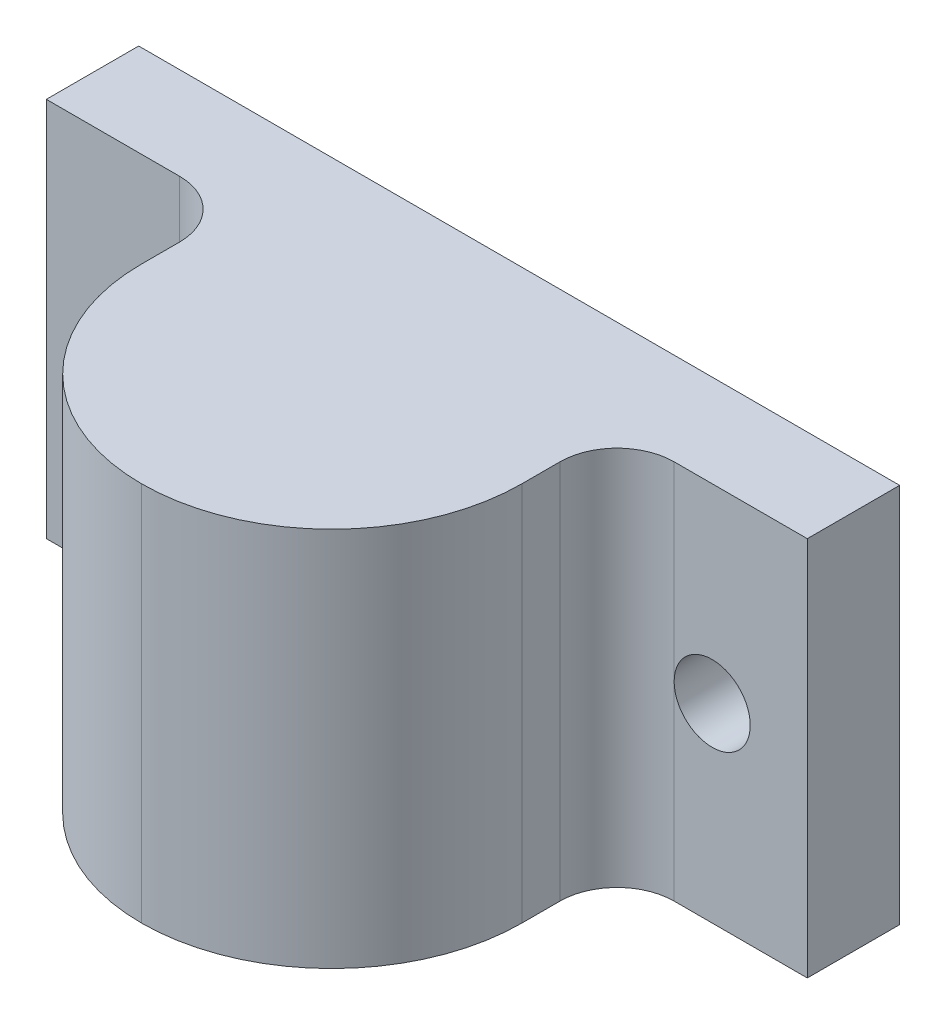
ISO-10303-21;
HEADER;
FILE_DESCRIPTION(('STEP AP214'),'2;1');
FILE_NAME('part.step','',(''),(''),'','','');
FILE_SCHEMA(('AUTOMOTIVE_DESIGN { 1 0 10303 214 1 1 1 1 }'));
ENDSEC;
DATA;
#1=APPLICATION_CONTEXT('core data for automotive mechanical design processes');
#2=APPLICATION_PROTOCOL_DEFINITION('international standard','automotive_design',2000,#1);
#3=PRODUCT_CONTEXT('',#1,'mechanical');
#4=PRODUCT('Part','Part','',(#3));
#5=PRODUCT_RELATED_PRODUCT_CATEGORY('part','',(#4));
#6=PRODUCT_DEFINITION_FORMATION('','',#4);
#7=PRODUCT_DEFINITION_CONTEXT('part definition',#1,'design');
#8=PRODUCT_DEFINITION('design','',#6,#7);
#9=PRODUCT_DEFINITION_SHAPE('','',#8);
#10=(LENGTH_UNIT() NAMED_UNIT(*) SI_UNIT(.MILLI.,.METRE.));
#11=(NAMED_UNIT(*) PLANE_ANGLE_UNIT() SI_UNIT($,.RADIAN.));
#12=(NAMED_UNIT(*) SI_UNIT($,.STERADIAN.) SOLID_ANGLE_UNIT());
#13=UNCERTAINTY_MEASURE_WITH_UNIT(LENGTH_MEASURE(1.E-05),#10,'distance_accuracy_value','');
#14=(GEOMETRIC_REPRESENTATION_CONTEXT(3) GLOBAL_UNCERTAINTY_ASSIGNED_CONTEXT((#13)) GLOBAL_UNIT_ASSIGNED_CONTEXT((#10,
#11,#12)) REPRESENTATION_CONTEXT('',''));
#15=CARTESIAN_POINT('',(0.,0.,0.));
#16=DIRECTION('',(0.,0.,1.));
#17=DIRECTION('',(1.,0.,0.));
#18=AXIS2_PLACEMENT_3D('',#15,#16,#17);
#19=CARTESIAN_POINT('',(-20.,10.,19.8547848106293));
#20=DIRECTION('',(1.,0.,0.));
#21=DIRECTION('',(0.,0.,-1.));
#22=AXIS2_PLACEMENT_3D('',#19,#20,#21);
#23=PLANE('',#22);
#24=DIRECTION('',(0.,-1.,0.));
#25=VECTOR('',#24,1.);
#26=CARTESIAN_POINT('',(-20.,10.,4.85478481062935));
#27=LINE('',#26,#25);
#28=CARTESIAN_POINT('',(-20.,10.,4.85478481062935));
#29=VERTEX_POINT('',#28);
#30=CARTESIAN_POINT('',(-20.,-10.,4.85478481062935));
#31=VERTEX_POINT('',#30);
#32=EDGE_CURVE('E201',#29,#31,#27,.T.);
#33=ORIENTED_EDGE('',*,*,#32,.F.);
#34=DIRECTION('',(0.,0.,-1.));
#35=VECTOR('',#34,1.);
#36=CARTESIAN_POINT('',(-20.,10.,19.8547848106293));
#37=LINE('',#36,#35);
#38=CARTESIAN_POINT('',(-20.,10.,0.));
#39=VERTEX_POINT('',#38);
#40=EDGE_CURVE('E146',#29,#39,#37,.T.);
#41=ORIENTED_EDGE('',*,*,#40,.T.);
#42=DIRECTION('',(0.,-1.,0.));
#43=VECTOR('',#42,1.);
#44=CARTESIAN_POINT('',(-20.,10.,0.));
#45=LINE('',#44,#43);
#46=CARTESIAN_POINT('',(-20.,-10.,0.));
#47=VERTEX_POINT('',#46);
#48=EDGE_CURVE('E218',#39,#47,#45,.T.);
#49=ORIENTED_EDGE('',*,*,#48,.T.);
#50=DIRECTION('',(0.,0.,-1.));
#51=VECTOR('',#50,1.);
#52=CARTESIAN_POINT('',(-20.,-10.,19.8547848106293));
#53=LINE('',#52,#51);
#54=EDGE_CURVE('E151',#31,#47,#53,.T.);
#55=ORIENTED_EDGE('',*,*,#54,.F.);
#56=EDGE_LOOP('',(#33,#41,#49,#55));
#57=FACE_BOUND('',#56,.T.);
#58=ADVANCED_FACE('F33',(#57),#23,.F.);
#59=CARTESIAN_POINT('',(20.,10.,19.8547848106293));
#60=DIRECTION('',(-1.,0.,0.));
#61=DIRECTION('',(0.,-1.,0.));
#62=AXIS2_PLACEMENT_3D('',#59,#60,#61);
#63=PLANE('',#62);
#64=DIRECTION('',(0.,0.,-1.));
#65=VECTOR('',#64,1.);
#66=CARTESIAN_POINT('',(20.,10.,19.8547848106293));
#67=LINE('',#66,#65);
#68=CARTESIAN_POINT('',(20.,10.,4.85478481062935));
#69=VERTEX_POINT('',#68);
#70=CARTESIAN_POINT('',(20.,10.,0.));
#71=VERTEX_POINT('',#70);
#72=EDGE_CURVE('E137',#69,#71,#67,.T.);
#73=ORIENTED_EDGE('',*,*,#72,.F.);
#74=DIRECTION('',(0.,1.,0.));
#75=VECTOR('',#74,1.);
#76=CARTESIAN_POINT('',(20.,10.,4.85478481062935));
#77=LINE('',#76,#75);
#78=CARTESIAN_POINT('',(20.,-10.,4.85478481062935));
#79=VERTEX_POINT('',#78);
#80=EDGE_CURVE('E121',#79,#69,#77,.T.);
#81=ORIENTED_EDGE('',*,*,#80,.F.);
#82=DIRECTION('',(0.,0.,-1.));
#83=VECTOR('',#82,1.);
#84=CARTESIAN_POINT('',(20.,-10.,19.8547848106293));
#85=LINE('',#84,#83);
#86=CARTESIAN_POINT('',(20.,-10.,0.));
#87=VERTEX_POINT('',#86);
#88=EDGE_CURVE('E224',#79,#87,#85,.T.);
#89=ORIENTED_EDGE('',*,*,#88,.T.);
#90=DIRECTION('',(0.,1.,0.));
#91=VECTOR('',#90,1.);
#92=CARTESIAN_POINT('',(20.,10.,0.));
#93=LINE('',#92,#91);
#94=EDGE_CURVE('E144',#87,#71,#93,.T.);
#95=ORIENTED_EDGE('',*,*,#94,.T.);
#96=EDGE_LOOP('',(#73,#81,#89,#95));
#97=FACE_BOUND('',#96,.T.);
#98=ADVANCED_FACE('F142',(#97),#63,.F.);
#99=CARTESIAN_POINT('',(-20.,10.,19.8547848106293));
#100=DIRECTION('',(0.,-1.,0.));
#101=DIRECTION('',(0.,0.,-1.));
#102=AXIS2_PLACEMENT_3D('',#99,#100,#101);
#103=PLANE('',#102);
#104=DIRECTION('',(-1.,0.,0.));
#105=VECTOR('',#104,1.);
#106=CARTESIAN_POINT('',(-20.,10.,4.85478481062935));
#107=LINE('',#106,#105);
#108=CARTESIAN_POINT('',(-13.,10.,4.85478481062935));
#109=VERTEX_POINT('',#108);
#110=EDGE_CURVE('E202',#109,#29,#107,.T.);
#111=ORIENTED_EDGE('',*,*,#110,.F.);
#112=CARTESIAN_POINT('',(-13.,10.,7.85478481062935));
#113=DIRECTION('',(0.,-1.,0.));
#114=DIRECTION('',(0.,0.,-1.));
#115=AXIS2_PLACEMENT_3D('',#112,#113,#114);
#116=CIRCLE('',#115,3.);
#117=CARTESIAN_POINT('',(-10.,10.,7.85478481062935));
#118=VERTEX_POINT('',#117);
#119=EDGE_CURVE('E182',#109,#118,#116,.T.);
#120=ORIENTED_EDGE('',*,*,#119,.T.);
#121=DIRECTION('',(0.,0.,1.));
#122=VECTOR('',#121,1.);
#123=CARTESIAN_POINT('',(-10.,10.,4.85478481062935));
#124=LINE('',#123,#122);
#125=CARTESIAN_POINT('',(-10.,10.,9.85478481062935));
#126=VERTEX_POINT('',#125);
#127=EDGE_CURVE('E210',#118,#126,#124,.T.);
#128=ORIENTED_EDGE('',*,*,#127,.T.);
#129=CARTESIAN_POINT('',(0.,10.,9.85478481062935));
#130=DIRECTION('',(0.,-1.,0.));
#131=DIRECTION('',(0.,0.,-1.));
#132=AXIS2_PLACEMENT_3D('',#129,#130,#131);
#133=CIRCLE('',#132,10.);
#134=CARTESIAN_POINT('',(0.,10.,19.8547848106293));
#135=VERTEX_POINT('',#134);
#136=EDGE_CURVE('E165',#126,#135,#133,.F.);
#137=ORIENTED_EDGE('',*,*,#136,.T.);
#138=CARTESIAN_POINT('',(0.,10.,9.85478481062935));
#139=DIRECTION('',(0.,-1.,0.));
#140=DIRECTION('',(0.,0.,-1.));
#141=AXIS2_PLACEMENT_3D('',#138,#139,#140);
#142=CIRCLE('',#141,10.);
#143=CARTESIAN_POINT('',(10.,10.,9.85478481062935));
#144=VERTEX_POINT('',#143);
#145=EDGE_CURVE('E159',#135,#144,#142,.F.);
#146=ORIENTED_EDGE('',*,*,#145,.T.);
#147=DIRECTION('',(0.,0.,1.));
#148=VECTOR('',#147,1.);
#149=CARTESIAN_POINT('',(10.,10.,4.85478481062935));
#150=LINE('',#149,#148);
#151=CARTESIAN_POINT('',(10.,10.,7.85478481062935));
#152=VERTEX_POINT('',#151);
#153=EDGE_CURVE('E287',#152,#144,#150,.T.);
#154=ORIENTED_EDGE('',*,*,#153,.F.);
#155=CARTESIAN_POINT('',(13.,10.,7.85478481062935));
#156=DIRECTION('',(0.,-1.,0.));
#157=DIRECTION('',(0.,0.,-1.));
#158=AXIS2_PLACEMENT_3D('',#155,#156,#157);
#159=CIRCLE('',#158,3.);
#160=CARTESIAN_POINT('',(13.,10.,4.85478481062935));
#161=VERTEX_POINT('',#160);
#162=EDGE_CURVE('E11',#152,#161,#159,.T.);
#163=ORIENTED_EDGE('',*,*,#162,.T.);
#164=DIRECTION('',(-1.,0.,0.));
#165=VECTOR('',#164,1.);
#166=CARTESIAN_POINT('',(20.,10.,4.85478481062935));
#167=LINE('',#166,#165);
#168=EDGE_CURVE('E125',#69,#161,#167,.T.);
#169=ORIENTED_EDGE('',*,*,#168,.F.);
#170=ORIENTED_EDGE('',*,*,#72,.T.);
#171=DIRECTION('',(-1.,0.,0.));
#172=VECTOR('',#171,1.);
#173=CARTESIAN_POINT('',(-20.,10.,0.));
#174=LINE('',#173,#172);
#175=EDGE_CURVE('E216',#71,#39,#174,.T.);
#176=ORIENTED_EDGE('',*,*,#175,.T.);
#177=ORIENTED_EDGE('',*,*,#40,.F.);
#178=EDGE_LOOP('',(#111,#120,#128,#137,#146,#154,#163,#169,#170,#176,#177));
#179=FACE_BOUND('',#178,.T.);
#180=ADVANCED_FACE('F135',(#179),#103,.F.);
#181=CARTESIAN_POINT('',(-20.,-10.,19.8547848106293));
#182=DIRECTION('',(0.,1.,0.));
#183=DIRECTION('',(0.,0.,1.));
#184=AXIS2_PLACEMENT_3D('',#181,#182,#183);
#185=PLANE('',#184);
#186=CARTESIAN_POINT('',(0.,-10.,12.5));
#187=DIRECTION('',(0.,-1.,0.));
#188=DIRECTION('',(0.,0.,-1.));
#189=AXIS2_PLACEMENT_3D('',#186,#187,#188);
#190=CIRCLE('',#189,4.);
#191=CARTESIAN_POINT('',(0.,-10.,8.5));
#192=VERTEX_POINT('',#191);
#193=EDGE_CURVE('E281',#192,#192,#190,.T.);
#194=ORIENTED_EDGE('',*,*,#193,.F.);
#195=EDGE_LOOP('',(#194));
#196=FACE_BOUND('',#195,.T.);
#197=CARTESIAN_POINT('',(0.,-10.,9.85478481062935));
#198=DIRECTION('',(0.,1.,0.));
#199=DIRECTION('',(0.,0.,1.));
#200=AXIS2_PLACEMENT_3D('',#197,#198,#199);
#201=CIRCLE('',#200,10.);
#202=CARTESIAN_POINT('',(10.,-10.,9.85478481062935));
#203=VERTEX_POINT('',#202);
#204=CARTESIAN_POINT('',(0.,-10.,19.8547848106293));
#205=VERTEX_POINT('',#204);
#206=EDGE_CURVE('E149',#203,#205,#201,.F.);
#207=ORIENTED_EDGE('',*,*,#206,.T.);
#208=CARTESIAN_POINT('',(0.,-10.,9.85478481062935));
#209=DIRECTION('',(0.,1.,0.));
#210=DIRECTION('',(0.,0.,1.));
#211=AXIS2_PLACEMENT_3D('',#208,#209,#210);
#212=CIRCLE('',#211,10.);
#213=CARTESIAN_POINT('',(-10.,-10.,9.85478481062935));
#214=VERTEX_POINT('',#213);
#215=EDGE_CURVE('E167',#205,#214,#212,.F.);
#216=ORIENTED_EDGE('',*,*,#215,.T.);
#217=DIRECTION('',(0.,0.,1.));
#218=VECTOR('',#217,1.);
#219=CARTESIAN_POINT('',(-10.,-10.,4.85478481062935));
#220=LINE('',#219,#218);
#221=CARTESIAN_POINT('',(-10.,-10.,7.85478481062935));
#222=VERTEX_POINT('',#221);
#223=EDGE_CURVE('E192',#222,#214,#220,.T.);
#224=ORIENTED_EDGE('',*,*,#223,.F.);
#225=CARTESIAN_POINT('',(-13.,-10.,7.85478481062935));
#226=DIRECTION('',(0.,1.,0.));
#227=DIRECTION('',(0.,0.,1.));
#228=AXIS2_PLACEMENT_3D('',#225,#226,#227);
#229=CIRCLE('',#228,3.);
#230=CARTESIAN_POINT('',(-13.,-10.,4.85478481062935));
#231=VERTEX_POINT('',#230);
#232=EDGE_CURVE('E184',#222,#231,#229,.T.);
#233=ORIENTED_EDGE('',*,*,#232,.T.);
#234=DIRECTION('',(1.,0.,0.));
#235=VECTOR('',#234,1.);
#236=CARTESIAN_POINT('',(-20.,-10.,4.85478481062935));
#237=LINE('',#236,#235);
#238=EDGE_CURVE('E190',#31,#231,#237,.T.);
#239=ORIENTED_EDGE('',*,*,#238,.F.);
#240=ORIENTED_EDGE('',*,*,#54,.T.);
#241=DIRECTION('',(1.,0.,0.));
#242=VECTOR('',#241,1.);
#243=CARTESIAN_POINT('',(-20.,-10.,0.));
#244=LINE('',#243,#242);
#245=EDGE_CURVE('E221',#47,#87,#244,.T.);
#246=ORIENTED_EDGE('',*,*,#245,.T.);
#247=ORIENTED_EDGE('',*,*,#88,.F.);
#248=DIRECTION('',(1.,0.,0.));
#249=VECTOR('',#248,1.);
#250=CARTESIAN_POINT('',(20.,-10.,4.85478481062935));
#251=LINE('',#250,#249);
#252=CARTESIAN_POINT('',(13.,-10.,4.85478481062935));
#253=VERTEX_POINT('',#252);
#254=EDGE_CURVE('E127',#253,#79,#251,.T.);
#255=ORIENTED_EDGE('',*,*,#254,.F.);
#256=CARTESIAN_POINT('',(13.,-10.,7.85478481062935));
#257=DIRECTION('',(0.,1.,0.));
#258=DIRECTION('',(0.,0.,1.));
#259=AXIS2_PLACEMENT_3D('',#256,#257,#258);
#260=CIRCLE('',#259,3.);
#261=CARTESIAN_POINT('',(10.,-10.,7.85478481062935));
#262=VERTEX_POINT('',#261);
#263=EDGE_CURVE('E41',#253,#262,#260,.T.);
#264=ORIENTED_EDGE('',*,*,#263,.T.);
#265=DIRECTION('',(0.,0.,1.));
#266=VECTOR('',#265,1.);
#267=CARTESIAN_POINT('',(10.,-10.,4.85478481062935));
#268=LINE('',#267,#266);
#269=EDGE_CURVE('E288',#262,#203,#268,.T.);
#270=ORIENTED_EDGE('',*,*,#269,.T.);
#271=EDGE_LOOP('',(#207,#216,#224,#233,#239,#240,#246,#247,#255,#264,#270));
#272=FACE_BOUND('',#271,.T.);
#273=ADVANCED_FACE('F189',(#196,#272),#185,.F.);
#274=CARTESIAN_POINT('',(0.,0.,0.));
#275=DIRECTION('',(0.,0.,1.));
#276=DIRECTION('',(1.,0.,0.));
#277=AXIS2_PLACEMENT_3D('',#274,#275,#276);
#278=PLANE('',#277);
#279=CARTESIAN_POINT('',(15.,0.,0.));
#280=DIRECTION('',(0.,0.,1.));
#281=DIRECTION('',(1.,0.,0.));
#282=AXIS2_PLACEMENT_3D('',#279,#280,#281);
#283=CIRCLE('',#282,2.);
#284=CARTESIAN_POINT('',(17.,0.,0.));
#285=VERTEX_POINT('',#284);
#286=EDGE_CURVE('E273',#285,#285,#283,.T.);
#287=ORIENTED_EDGE('',*,*,#286,.T.);
#288=EDGE_LOOP('',(#287));
#289=FACE_BOUND('',#288,.T.);
#290=CARTESIAN_POINT('',(-15.,0.,0.));
#291=DIRECTION('',(0.,0.,1.));
#292=DIRECTION('',(1.,0.,0.));
#293=AXIS2_PLACEMENT_3D('',#290,#291,#292);
#294=CIRCLE('',#293,2.);
#295=CARTESIAN_POINT('',(-13.,0.,0.));
#296=VERTEX_POINT('',#295);
#297=EDGE_CURVE('E278',#296,#296,#294,.T.);
#298=ORIENTED_EDGE('',*,*,#297,.T.);
#299=EDGE_LOOP('',(#298));
#300=FACE_BOUND('',#299,.T.);
#301=ORIENTED_EDGE('',*,*,#94,.F.);
#302=ORIENTED_EDGE('',*,*,#245,.F.);
#303=ORIENTED_EDGE('',*,*,#48,.F.);
#304=ORIENTED_EDGE('',*,*,#175,.F.);
#305=EDGE_LOOP('',(#301,#302,#303,#304));
#306=FACE_BOUND('',#305,.T.);
#307=ADVANCED_FACE('F229',(#289,#300,#306),#278,.F.);
#308=CARTESIAN_POINT('',(-10.,10.,4.85478481062935));
#309=DIRECTION('',(1.,0.,0.));
#310=DIRECTION('',(0.,1.,0.));
#311=AXIS2_PLACEMENT_3D('',#308,#309,#310);
#312=PLANE('',#311);
#313=ORIENTED_EDGE('',*,*,#127,.F.);
#314=DIRECTION('',(0.,1.,0.));
#315=VECTOR('',#314,1.);
#316=CARTESIAN_POINT('',(-10.,10.,7.85478481062935));
#317=LINE('',#316,#315);
#318=EDGE_CURVE('E175',#118,#222,#317,.F.);
#319=ORIENTED_EDGE('',*,*,#318,.T.);
#320=ORIENTED_EDGE('',*,*,#223,.T.);
#321=DIRECTION('',(0.,1.,0.));
#322=VECTOR('',#321,1.);
#323=CARTESIAN_POINT('',(-10.,10.,9.85478481062935));
#324=LINE('',#323,#322);
#325=EDGE_CURVE('E162',#214,#126,#324,.T.);
#326=ORIENTED_EDGE('',*,*,#325,.T.);
#327=EDGE_LOOP('',(#313,#319,#320,#326));
#328=FACE_BOUND('',#327,.T.);
#329=ADVANCED_FACE('F231',(#328),#312,.F.);
#330=CARTESIAN_POINT('',(0.,0.,4.85478481062935));
#331=DIRECTION('',(0.,0.,1.));
#332=DIRECTION('',(1.,0.,0.));
#333=AXIS2_PLACEMENT_3D('',#330,#331,#332);
#334=PLANE('',#333);
#335=ORIENTED_EDGE('',*,*,#238,.T.);
#336=DIRECTION('',(0.,1.,0.));
#337=VECTOR('',#336,1.);
#338=CARTESIAN_POINT('',(-13.,0.,4.85478481062935));
#339=LINE('',#338,#337);
#340=CARTESIAN_POINT('',(-13.,0.,4.85478481062935));
#341=VERTEX_POINT('',#340);
#342=EDGE_CURVE('E172',#231,#341,#339,.T.);
#343=ORIENTED_EDGE('',*,*,#342,.T.);
#344=CARTESIAN_POINT('',(-15.,0.,4.85478481062935));
#345=DIRECTION('',(0.,0.,1.));
#346=DIRECTION('',(1.,0.,0.));
#347=AXIS2_PLACEMENT_3D('',#344,#345,#346);
#348=CIRCLE('',#347,2.);
#349=EDGE_CURVE('E206',#341,#341,#348,.T.);
#350=ORIENTED_EDGE('',*,*,#349,.F.);
#351=DIRECTION('',(0.,1.,0.));
#352=VECTOR('',#351,1.);
#353=CARTESIAN_POINT('',(-13.,0.,4.85478481062935));
#354=LINE('',#353,#352);
#355=EDGE_CURVE('E170',#341,#109,#354,.T.);
#356=ORIENTED_EDGE('',*,*,#355,.T.);
#357=ORIENTED_EDGE('',*,*,#110,.T.);
#358=ORIENTED_EDGE('',*,*,#32,.T.);
#359=EDGE_LOOP('',(#335,#343,#350,#356,#357,#358));
#360=FACE_BOUND('',#359,.T.);
#361=ADVANCED_FACE('F197',(#360),#334,.T.);
#362=CARTESIAN_POINT('',(10.,10.,4.85478481062935));
#363=DIRECTION('',(-1.,0.,0.));
#364=DIRECTION('',(0.,-1.,0.));
#365=AXIS2_PLACEMENT_3D('',#362,#363,#364);
#366=PLANE('',#365);
#367=ORIENTED_EDGE('',*,*,#269,.F.);
#368=DIRECTION('',(0.,-1.,0.));
#369=VECTOR('',#368,1.);
#370=CARTESIAN_POINT('',(10.,10.,7.85478481062935));
#371=LINE('',#370,#369);
#372=EDGE_CURVE('E54',#262,#152,#371,.F.);
#373=ORIENTED_EDGE('',*,*,#372,.T.);
#374=ORIENTED_EDGE('',*,*,#153,.T.);
#375=DIRECTION('',(0.,-1.,0.));
#376=VECTOR('',#375,1.);
#377=CARTESIAN_POINT('',(10.,-9.99999999999999,9.85478481062935));
#378=LINE('',#377,#376);
#379=EDGE_CURVE('E145',#144,#203,#378,.T.);
#380=ORIENTED_EDGE('',*,*,#379,.T.);
#381=EDGE_LOOP('',(#367,#373,#374,#380));
#382=FACE_BOUND('',#381,.T.);
#383=ADVANCED_FACE('F290',(#382),#366,.F.);
#384=CARTESIAN_POINT('',(0.,0.,4.85478481062935));
#385=DIRECTION('',(0.,0.,-1.));
#386=DIRECTION('',(-1.,0.,0.));
#387=AXIS2_PLACEMENT_3D('',#384,#385,#386);
#388=PLANE('',#387);
#389=ORIENTED_EDGE('',*,*,#168,.T.);
#390=DIRECTION('',(0.,-1.,0.));
#391=VECTOR('',#390,1.);
#392=CARTESIAN_POINT('',(13.,-10.,4.85478481062935));
#393=LINE('',#392,#391);
#394=CARTESIAN_POINT('',(13.,0.,4.85478481062935));
#395=VERTEX_POINT('',#394);
#396=EDGE_CURVE('E179',#161,#395,#393,.T.);
#397=ORIENTED_EDGE('',*,*,#396,.T.);
#398=CARTESIAN_POINT('',(15.,0.,4.85478481062935));
#399=DIRECTION('',(0.,0.,1.));
#400=DIRECTION('',(1.,0.,0.));
#401=AXIS2_PLACEMENT_3D('',#398,#399,#400);
#402=CIRCLE('',#401,2.);
#403=EDGE_CURVE('E270',#395,#395,#402,.T.);
#404=ORIENTED_EDGE('',*,*,#403,.F.);
#405=DIRECTION('',(0.,-1.,0.));
#406=VECTOR('',#405,1.);
#407=CARTESIAN_POINT('',(13.,-10.,4.85478481062935));
#408=LINE('',#407,#406);
#409=EDGE_CURVE('E177',#395,#253,#408,.T.);
#410=ORIENTED_EDGE('',*,*,#409,.T.);
#411=ORIENTED_EDGE('',*,*,#254,.T.);
#412=ORIENTED_EDGE('',*,*,#80,.T.);
#413=EDGE_LOOP('',(#389,#397,#404,#410,#411,#412));
#414=FACE_BOUND('',#413,.T.);
#415=ADVANCED_FACE('F123',(#414),#388,.F.);
#416=CARTESIAN_POINT('',(0.,5.,12.5));
#417=DIRECTION('',(0.,-1.,0.));
#418=DIRECTION('',(0.,0.,-1.));
#419=AXIS2_PLACEMENT_3D('',#416,#417,#418);
#420=CYLINDRICAL_SURFACE('',#419,4.);
#421=CARTESIAN_POINT('',(0.,5.,12.5));
#422=DIRECTION('',(0.,-1.,0.));
#423=DIRECTION('',(0.,0.,-1.));
#424=AXIS2_PLACEMENT_3D('',#421,#422,#423);
#425=CIRCLE('',#424,4.);
#426=CARTESIAN_POINT('',(0.,5.,8.5));
#427=VERTEX_POINT('',#426);
#428=EDGE_CURVE('E131',#427,#427,#425,.T.);
#429=ORIENTED_EDGE('',*,*,#428,.F.);
#430=EDGE_LOOP('',(#429));
#431=FACE_BOUND('',#430,.T.);
#432=ORIENTED_EDGE('',*,*,#193,.T.);
#433=EDGE_LOOP('',(#432));
#434=FACE_BOUND('',#433,.T.);
#435=ADVANCED_FACE('F304',(#431,#434),#420,.F.);
#436=CARTESIAN_POINT('',(0.,5.,12.5));
#437=DIRECTION('',(0.,-1.,0.));
#438=DIRECTION('',(0.,0.,-1.));
#439=AXIS2_PLACEMENT_3D('',#436,#437,#438);
#440=PLANE('',#439);
#441=ORIENTED_EDGE('',*,*,#428,.T.);
#442=EDGE_LOOP('',(#441));
#443=FACE_BOUND('',#442,.T.);
#444=ADVANCED_FACE('F310',(#443),#440,.T.);
#445=CARTESIAN_POINT('',(-15.,0.,-0.145215189370651));
#446=DIRECTION('',(0.,0.,1.));
#447=DIRECTION('',(1.,0.,0.));
#448=AXIS2_PLACEMENT_3D('',#445,#446,#447);
#449=CYLINDRICAL_SURFACE('',#448,2.);
#450=ORIENTED_EDGE('',*,*,#349,.T.);
#451=EDGE_LOOP('',(#450));
#452=FACE_BOUND('',#451,.T.);
#453=ORIENTED_EDGE('',*,*,#297,.F.);
#454=EDGE_LOOP('',(#453));
#455=FACE_BOUND('',#454,.T.);
#456=ADVANCED_FACE('F314',(#452,#455),#449,.F.);
#457=CARTESIAN_POINT('',(15.,0.,-0.145215189370651));
#458=DIRECTION('',(0.,0.,1.));
#459=DIRECTION('',(1.,0.,0.));
#460=AXIS2_PLACEMENT_3D('',#457,#458,#459);
#461=CYLINDRICAL_SURFACE('',#460,2.);
#462=ORIENTED_EDGE('',*,*,#403,.T.);
#463=EDGE_LOOP('',(#462));
#464=FACE_BOUND('',#463,.T.);
#465=ORIENTED_EDGE('',*,*,#286,.F.);
#466=EDGE_LOOP('',(#465));
#467=FACE_BOUND('',#466,.T.);
#468=ADVANCED_FACE('F257',(#464,#467),#461,.F.);
#469=CARTESIAN_POINT('',(0.,10.,9.85478481062935));
#470=DIRECTION('',(0.,1.,0.));
#471=DIRECTION('',(-1.,0.,0.));
#472=AXIS2_PLACEMENT_3D('',#469,#470,#471);
#473=CYLINDRICAL_SURFACE('',#472,10.);
#474=ORIENTED_EDGE('',*,*,#145,.F.);
#475=DIRECTION('',(0.,-1.,0.));
#476=VECTOR('',#475,1.);
#477=CARTESIAN_POINT('',(0.,10.,19.8547848106293));
#478=LINE('',#477,#476);
#479=EDGE_CURVE('E156',#205,#135,#478,.F.);
#480=ORIENTED_EDGE('',*,*,#479,.F.);
#481=ORIENTED_EDGE('',*,*,#206,.F.);
#482=ORIENTED_EDGE('',*,*,#379,.F.);
#483=EDGE_LOOP('',(#474,#480,#481,#482));
#484=FACE_BOUND('',#483,.T.);
#485=ADVANCED_FACE('F253',(#484),#473,.T.);
#486=CARTESIAN_POINT('',(0.,10.,9.85478481062935));
#487=DIRECTION('',(0.,-1.,0.));
#488=DIRECTION('',(1.,0.,0.));
#489=AXIS2_PLACEMENT_3D('',#486,#487,#488);
#490=CYLINDRICAL_SURFACE('',#489,10.);
#491=ORIENTED_EDGE('',*,*,#215,.F.);
#492=ORIENTED_EDGE('',*,*,#479,.T.);
#493=ORIENTED_EDGE('',*,*,#136,.F.);
#494=ORIENTED_EDGE('',*,*,#325,.F.);
#495=EDGE_LOOP('',(#491,#492,#493,#494));
#496=FACE_BOUND('',#495,.T.);
#497=ADVANCED_FACE('F256',(#496),#490,.T.);
#498=CARTESIAN_POINT('',(-13.,0.,7.85478481062935));
#499=DIRECTION('',(0.,1.,0.));
#500=DIRECTION('',(-1.,0.,0.));
#501=AXIS2_PLACEMENT_3D('',#498,#499,#500);
#502=CYLINDRICAL_SURFACE('',#501,3.);
#503=ORIENTED_EDGE('',*,*,#232,.F.);
#504=ORIENTED_EDGE('',*,*,#318,.F.);
#505=ORIENTED_EDGE('',*,*,#119,.F.);
#506=ORIENTED_EDGE('',*,*,#355,.F.);
#507=ORIENTED_EDGE('',*,*,#342,.F.);
#508=EDGE_LOOP('',(#503,#504,#505,#506,#507));
#509=FACE_BOUND('',#508,.T.);
#510=ADVANCED_FACE('F204',(#509),#502,.F.);
#511=CARTESIAN_POINT('',(13.,0.,7.85478481062935));
#512=DIRECTION('',(0.,1.,0.));
#513=DIRECTION('',(-1.,0.,0.));
#514=AXIS2_PLACEMENT_3D('',#511,#512,#513);
#515=CYLINDRICAL_SURFACE('',#514,3.);
#516=ORIENTED_EDGE('',*,*,#162,.F.);
#517=ORIENTED_EDGE('',*,*,#372,.F.);
#518=ORIENTED_EDGE('',*,*,#263,.F.);
#519=ORIENTED_EDGE('',*,*,#409,.F.);
#520=ORIENTED_EDGE('',*,*,#396,.F.);
#521=EDGE_LOOP('',(#516,#517,#518,#519,#520));
#522=FACE_BOUND('',#521,.T.);
#523=ADVANCED_FACE('F35',(#522),#515,.F.);
#524=CLOSED_SHELL('',(#58,#98,#180,#273,#307,#329,#361,#383,#415,#435,#444,#456,#468,#485,#497,
#510,#523));
#525=MANIFOLD_SOLID_BREP('B2',#524);
#526=ADVANCED_BREP_SHAPE_REPRESENTATION('',(#18,#525),#14);
#527=SHAPE_DEFINITION_REPRESENTATION(#9,#526);
ENDSEC;
END-ISO-10303-21;
